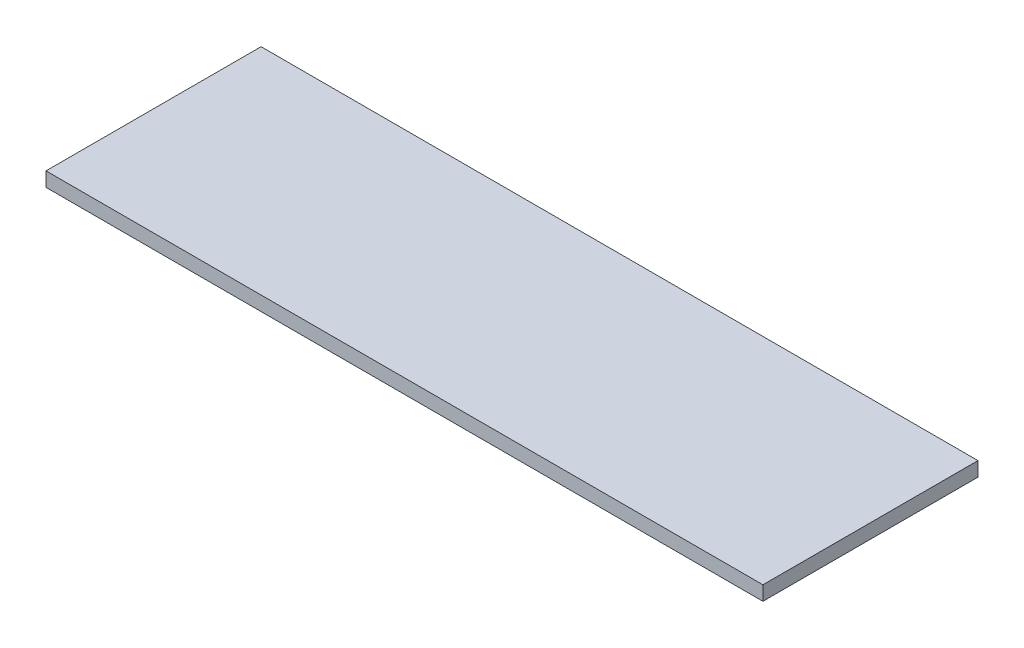
ISO-10303-21;
HEADER;
FILE_DESCRIPTION(('STEP AP214'),'2;1');
FILE_NAME('part.step','',(''),(''),'','','');
FILE_SCHEMA(('AUTOMOTIVE_DESIGN { 1 0 10303 214 1 1 1 1 }'));
ENDSEC;
DATA;
#1=APPLICATION_CONTEXT('core data for automotive mechanical design processes');
#2=APPLICATION_PROTOCOL_DEFINITION('international standard','automotive_design',2000,#1);
#3=PRODUCT_CONTEXT('',#1,'mechanical');
#4=PRODUCT('Part','Part','',(#3));
#5=PRODUCT_RELATED_PRODUCT_CATEGORY('part','',(#4));
#6=PRODUCT_DEFINITION_FORMATION('','',#4);
#7=PRODUCT_DEFINITION_CONTEXT('part definition',#1,'design');
#8=PRODUCT_DEFINITION('design','',#6,#7);
#9=PRODUCT_DEFINITION_SHAPE('','',#8);
#10=(LENGTH_UNIT() NAMED_UNIT(*) SI_UNIT(.MILLI.,.METRE.));
#11=(NAMED_UNIT(*) PLANE_ANGLE_UNIT() SI_UNIT($,.RADIAN.));
#12=(NAMED_UNIT(*) SI_UNIT($,.STERADIAN.) SOLID_ANGLE_UNIT());
#13=UNCERTAINTY_MEASURE_WITH_UNIT(LENGTH_MEASURE(1.E-05),#10,'distance_accuracy_value','');
#14=(GEOMETRIC_REPRESENTATION_CONTEXT(3) GLOBAL_UNCERTAINTY_ASSIGNED_CONTEXT((#13)) GLOBAL_UNIT_ASSIGNED_CONTEXT((#10,
#11,#12)) REPRESENTATION_CONTEXT('',''));
#15=CARTESIAN_POINT('',(0.,0.,0.));
#16=DIRECTION('',(0.,0.,1.));
#17=DIRECTION('',(1.,0.,0.));
#18=AXIS2_PLACEMENT_3D('',#15,#16,#17);
#19=CARTESIAN_POINT('',(5.,0.,0.));
#20=DIRECTION('',(0.,0.,1.));
#21=DIRECTION('',(1.,0.,0.));
#22=AXIS2_PLACEMENT_3D('',#19,#20,#21);
#23=PLANE('',#22);
#24=CARTESIAN_POINT('',(0.,5.,0.));
#25=DIRECTION('',(0.,0.,1.));
#26=DIRECTION('',(1.,0.,0.));
#27=AXIS2_PLACEMENT_3D('',#24,#25,#26);
#28=CIRCLE('',#27,1.5);
#29=CARTESIAN_POINT('',(-1.5,5.,0.));
#30=VERTEX_POINT('',#29);
#31=EDGE_CURVE('E166',#30,#30,#28,.T.);
#32=ORIENTED_EDGE('',*,*,#31,.T.);
#33=EDGE_LOOP('',(#32));
#34=FACE_BOUND('',#33,.T.);
#35=DIRECTION('',(0.,1.,0.));
#36=VECTOR('',#35,1.);
#37=CARTESIAN_POINT('',(-5.,0.,0.));
#38=LINE('',#37,#36);
#39=CARTESIAN_POINT('',(-5.,0.,0.));
#40=VERTEX_POINT('',#39);
#41=CARTESIAN_POINT('',(-5.,25.,0.));
#42=VERTEX_POINT('',#41);
#43=EDGE_CURVE('E71',#40,#42,#38,.T.);
#44=ORIENTED_EDGE('',*,*,#43,.T.);
#45=DIRECTION('',(-1.,0.,0.));
#46=VECTOR('',#45,1.);
#47=CARTESIAN_POINT('',(5.,25.,0.));
#48=LINE('',#47,#46);
#49=CARTESIAN_POINT('',(5.,25.,0.));
#50=VERTEX_POINT('',#49);
#51=EDGE_CURVE('E44',#50,#42,#48,.T.);
#52=ORIENTED_EDGE('',*,*,#51,.F.);
#53=DIRECTION('',(0.,1.,0.));
#54=VECTOR('',#53,1.);
#55=CARTESIAN_POINT('',(5.,0.,0.));
#56=LINE('',#55,#54);
#57=CARTESIAN_POINT('',(5.,0.,0.));
#58=VERTEX_POINT('',#57);
#59=EDGE_CURVE('E73',#58,#50,#56,.T.);
#60=ORIENTED_EDGE('',*,*,#59,.F.);
#61=DIRECTION('',(-1.,0.,0.));
#62=VECTOR('',#61,1.);
#63=CARTESIAN_POINT('',(5.,0.,0.));
#64=LINE('',#63,#62);
#65=EDGE_CURVE('E52',#58,#40,#64,.T.);
#66=ORIENTED_EDGE('',*,*,#65,.T.);
#67=EDGE_LOOP('',(#44,#52,#60,#66));
#68=FACE_BOUND('',#67,.T.);
#69=ADVANCED_FACE('F35',(#34,#68),#23,.F.);
#70=CARTESIAN_POINT('',(5.,0.,-2.));
#71=DIRECTION('',(0.,0.,-1.));
#72=DIRECTION('',(-1.,0.,0.));
#73=AXIS2_PLACEMENT_3D('',#70,#71,#72);
#74=PLANE('',#73);
#75=DIRECTION('',(-1.,0.,0.));
#76=VECTOR('',#75,1.);
#77=CARTESIAN_POINT('',(5.,25.,-2.));
#78=LINE('',#77,#76);
#79=CARTESIAN_POINT('',(50.,25.,-2.));
#80=VERTEX_POINT('',#79);
#81=CARTESIAN_POINT('',(-50.,25.,-2.));
#82=VERTEX_POINT('',#81);
#83=EDGE_CURVE('E105',#80,#82,#78,.T.);
#84=ORIENTED_EDGE('',*,*,#83,.T.);
#85=DIRECTION('',(0.,-1.,0.));
#86=VECTOR('',#85,1.);
#87=CARTESIAN_POINT('',(-50.,0.,-2.));
#88=LINE('',#87,#86);
#89=CARTESIAN_POINT('',(-50.,27.,-2.));
#90=VERTEX_POINT('',#89);
#91=EDGE_CURVE('E165',#90,#82,#88,.T.);
#92=ORIENTED_EDGE('',*,*,#91,.F.);
#93=DIRECTION('',(-1.,0.,0.));
#94=VECTOR('',#93,1.);
#95=CARTESIAN_POINT('',(5.,27.,-2.));
#96=LINE('',#95,#94);
#97=CARTESIAN_POINT('',(50.,27.,-2.));
#98=VERTEX_POINT('',#97);
#99=EDGE_CURVE('E102',#98,#90,#96,.T.);
#100=ORIENTED_EDGE('',*,*,#99,.F.);
#101=DIRECTION('',(0.,-1.,0.));
#102=VECTOR('',#101,1.);
#103=CARTESIAN_POINT('',(50.,0.,-2.));
#104=LINE('',#103,#102);
#105=EDGE_CURVE('E151',#98,#80,#104,.T.);
#106=ORIENTED_EDGE('',*,*,#105,.T.);
#107=EDGE_LOOP('',(#84,#92,#100,#106));
#108=FACE_BOUND('',#107,.T.);
#109=ADVANCED_FACE('F157',(#108),#74,.T.);
#110=CARTESIAN_POINT('',(5.,27.,0.));
#111=DIRECTION('',(0.,1.,0.));
#112=DIRECTION('',(0.,0.,1.));
#113=AXIS2_PLACEMENT_3D('',#110,#111,#112);
#114=PLANE('',#113);
#115=ORIENTED_EDGE('',*,*,#99,.T.);
#116=DIRECTION('',(0.,0.,-1.));
#117=VECTOR('',#116,1.);
#118=CARTESIAN_POINT('',(-50.,27.,0.));
#119=LINE('',#118,#117);
#120=CARTESIAN_POINT('',(-50.,27.,28.));
#121=VERTEX_POINT('',#120);
#122=EDGE_CURVE('E168',#121,#90,#119,.T.);
#123=ORIENTED_EDGE('',*,*,#122,.F.);
#124=DIRECTION('',(-1.,0.,0.));
#125=VECTOR('',#124,1.);
#126=CARTESIAN_POINT('',(5.,27.,28.));
#127=LINE('',#126,#125);
#128=CARTESIAN_POINT('',(50.,27.,28.));
#129=VERTEX_POINT('',#128);
#130=EDGE_CURVE('E99',#129,#121,#127,.T.);
#131=ORIENTED_EDGE('',*,*,#130,.F.);
#132=DIRECTION('',(0.,0.,-1.));
#133=VECTOR('',#132,1.);
#134=CARTESIAN_POINT('',(50.,27.,0.));
#135=LINE('',#134,#133);
#136=EDGE_CURVE('E158',#129,#98,#135,.T.);
#137=ORIENTED_EDGE('',*,*,#136,.T.);
#138=EDGE_LOOP('',(#115,#123,#131,#137));
#139=FACE_BOUND('',#138,.T.);
#140=ADVANCED_FACE('F197',(#139),#114,.T.);
#141=CARTESIAN_POINT('',(5.,0.,28.));
#142=DIRECTION('',(0.,0.,1.));
#143=DIRECTION('',(1.,0.,0.));
#144=AXIS2_PLACEMENT_3D('',#141,#142,#143);
#145=PLANE('',#144);
#146=ORIENTED_EDGE('',*,*,#130,.T.);
#147=DIRECTION('',(0.,1.,0.));
#148=VECTOR('',#147,1.);
#149=CARTESIAN_POINT('',(-50.,0.,28.));
#150=LINE('',#149,#148);
#151=CARTESIAN_POINT('',(-50.,25.,28.));
#152=VERTEX_POINT('',#151);
#153=EDGE_CURVE('E155',#152,#121,#150,.T.);
#154=ORIENTED_EDGE('',*,*,#153,.F.);
#155=DIRECTION('',(-1.,0.,0.));
#156=VECTOR('',#155,1.);
#157=CARTESIAN_POINT('',(5.,25.,28.));
#158=LINE('',#157,#156);
#159=CARTESIAN_POINT('',(50.,25.,28.));
#160=VERTEX_POINT('',#159);
#161=EDGE_CURVE('E96',#160,#152,#158,.T.);
#162=ORIENTED_EDGE('',*,*,#161,.F.);
#163=DIRECTION('',(0.,1.,0.));
#164=VECTOR('',#163,1.);
#165=CARTESIAN_POINT('',(50.,0.,28.));
#166=LINE('',#165,#164);
#167=EDGE_CURVE('E154',#160,#129,#166,.T.);
#168=ORIENTED_EDGE('',*,*,#167,.T.);
#169=EDGE_LOOP('',(#146,#154,#162,#168));
#170=FACE_BOUND('',#169,.T.);
#171=ADVANCED_FACE('F189',(#170),#145,.T.);
#172=CARTESIAN_POINT('',(5.,25.,0.));
#173=DIRECTION('',(0.,-1.,0.));
#174=DIRECTION('',(0.,0.,-1.));
#175=AXIS2_PLACEMENT_3D('',#172,#173,#174);
#176=PLANE('',#175);
#177=DIRECTION('',(0.,0.,1.));
#178=VECTOR('',#177,1.);
#179=CARTESIAN_POINT('',(50.,25.,0.));
#180=LINE('',#179,#178);
#181=EDGE_CURVE('E139',#80,#160,#180,.T.);
#182=ORIENTED_EDGE('',*,*,#181,.T.);
#183=ORIENTED_EDGE('',*,*,#161,.T.);
#184=DIRECTION('',(0.,0.,1.));
#185=VECTOR('',#184,1.);
#186=CARTESIAN_POINT('',(-50.,25.,0.));
#187=LINE('',#186,#185);
#188=EDGE_CURVE('E142',#82,#152,#187,.T.);
#189=ORIENTED_EDGE('',*,*,#188,.F.);
#190=ORIENTED_EDGE('',*,*,#83,.F.);
#191=EDGE_LOOP('',(#182,#183,#189,#190));
#192=FACE_BOUND('',#191,.T.);
#193=DIRECTION('',(-1.,0.,0.));
#194=VECTOR('',#193,1.);
#195=CARTESIAN_POINT('',(5.,25.,2.));
#196=LINE('',#195,#194);
#197=CARTESIAN_POINT('',(5.,25.,2.));
#198=VERTEX_POINT('',#197);
#199=CARTESIAN_POINT('',(-5.,25.,2.));
#200=VERTEX_POINT('',#199);
#201=EDGE_CURVE('E94',#198,#200,#196,.T.);
#202=ORIENTED_EDGE('',*,*,#201,.F.);
#203=DIRECTION('',(0.,0.,-1.));
#204=VECTOR('',#203,1.);
#205=CARTESIAN_POINT('',(5.,25.,0.));
#206=LINE('',#205,#204);
#207=EDGE_CURVE('E85',#198,#50,#206,.T.);
#208=ORIENTED_EDGE('',*,*,#207,.T.);
#209=ORIENTED_EDGE('',*,*,#51,.T.);
#210=DIRECTION('',(0.,0.,-1.));
#211=VECTOR('',#210,1.);
#212=CARTESIAN_POINT('',(-5.,25.,0.));
#213=LINE('',#212,#211);
#214=EDGE_CURVE('E11',#200,#42,#213,.T.);
#215=ORIENTED_EDGE('',*,*,#214,.F.);
#216=EDGE_LOOP('',(#202,#208,#209,#215));
#217=FACE_BOUND('',#216,.T.);
#218=ADVANCED_FACE('F111',(#192,#217),#176,.T.);
#219=CARTESIAN_POINT('',(5.,0.,2.));
#220=DIRECTION('',(0.,0.,1.));
#221=DIRECTION('',(1.,0.,0.));
#222=AXIS2_PLACEMENT_3D('',#219,#220,#221);
#223=PLANE('',#222);
#224=CARTESIAN_POINT('',(0.,5.,2.));
#225=DIRECTION('',(0.,0.,1.));
#226=DIRECTION('',(1.,0.,0.));
#227=AXIS2_PLACEMENT_3D('',#224,#225,#226);
#228=CIRCLE('',#227,1.5);
#229=CARTESIAN_POINT('',(-1.5,5.,2.));
#230=VERTEX_POINT('',#229);
#231=EDGE_CURVE('E38',#230,#230,#228,.T.);
#232=ORIENTED_EDGE('',*,*,#231,.F.);
#233=EDGE_LOOP('',(#232));
#234=FACE_BOUND('',#233,.T.);
#235=DIRECTION('',(0.,1.,0.));
#236=VECTOR('',#235,1.);
#237=CARTESIAN_POINT('',(-5.,0.,2.));
#238=LINE('',#237,#236);
#239=CARTESIAN_POINT('',(-5.,0.,2.));
#240=VERTEX_POINT('',#239);
#241=EDGE_CURVE('E84',#240,#200,#238,.T.);
#242=ORIENTED_EDGE('',*,*,#241,.F.);
#243=DIRECTION('',(-1.,0.,0.));
#244=VECTOR('',#243,1.);
#245=CARTESIAN_POINT('',(5.,0.,2.));
#246=LINE('',#245,#244);
#247=CARTESIAN_POINT('',(5.,0.,2.));
#248=VERTEX_POINT('',#247);
#249=EDGE_CURVE('E65',#248,#240,#246,.T.);
#250=ORIENTED_EDGE('',*,*,#249,.F.);
#251=DIRECTION('',(0.,1.,0.));
#252=VECTOR('',#251,1.);
#253=CARTESIAN_POINT('',(5.,0.,2.));
#254=LINE('',#253,#252);
#255=EDGE_CURVE('E89',#248,#198,#254,.T.);
#256=ORIENTED_EDGE('',*,*,#255,.T.);
#257=ORIENTED_EDGE('',*,*,#201,.T.);
#258=EDGE_LOOP('',(#242,#250,#256,#257));
#259=FACE_BOUND('',#258,.T.);
#260=ADVANCED_FACE('F180',(#234,#259),#223,.T.);
#261=CARTESIAN_POINT('',(5.,0.,0.));
#262=DIRECTION('',(0.,-1.,0.));
#263=DIRECTION('',(0.,0.,-1.));
#264=AXIS2_PLACEMENT_3D('',#261,#262,#263);
#265=PLANE('',#264);
#266=DIRECTION('',(0.,0.,1.));
#267=VECTOR('',#266,1.);
#268=CARTESIAN_POINT('',(-5.,0.,0.));
#269=LINE('',#268,#267);
#270=EDGE_CURVE('E81',#40,#240,#269,.T.);
#271=ORIENTED_EDGE('',*,*,#270,.F.);
#272=ORIENTED_EDGE('',*,*,#65,.F.);
#273=DIRECTION('',(0.,0.,1.));
#274=VECTOR('',#273,1.);
#275=CARTESIAN_POINT('',(5.,0.,0.));
#276=LINE('',#275,#274);
#277=EDGE_CURVE('E75',#58,#248,#276,.T.);
#278=ORIENTED_EDGE('',*,*,#277,.T.);
#279=ORIENTED_EDGE('',*,*,#249,.T.);
#280=EDGE_LOOP('',(#271,#272,#278,#279));
#281=FACE_BOUND('',#280,.T.);
#282=ADVANCED_FACE('F87',(#281),#265,.T.);
#283=CARTESIAN_POINT('',(5.,0.,0.));
#284=DIRECTION('',(1.,0.,0.));
#285=DIRECTION('',(0.,0.,-1.));
#286=AXIS2_PLACEMENT_3D('',#283,#284,#285);
#287=PLANE('',#286);
#288=ORIENTED_EDGE('',*,*,#207,.F.);
#289=ORIENTED_EDGE('',*,*,#255,.F.);
#290=ORIENTED_EDGE('',*,*,#277,.F.);
#291=ORIENTED_EDGE('',*,*,#59,.T.);
#292=EDGE_LOOP('',(#288,#289,#290,#291));
#293=FACE_BOUND('',#292,.T.);
#294=ADVANCED_FACE('F178',(#293),#287,.T.);
#295=CARTESIAN_POINT('',(-5.,0.,0.));
#296=DIRECTION('',(1.,0.,0.));
#297=DIRECTION('',(0.,0.,-1.));
#298=AXIS2_PLACEMENT_3D('',#295,#296,#297);
#299=PLANE('',#298);
#300=ORIENTED_EDGE('',*,*,#241,.T.);
#301=ORIENTED_EDGE('',*,*,#214,.T.);
#302=ORIENTED_EDGE('',*,*,#43,.F.);
#303=ORIENTED_EDGE('',*,*,#270,.T.);
#304=EDGE_LOOP('',(#300,#301,#302,#303));
#305=FACE_BOUND('',#304,.T.);
#306=ADVANCED_FACE('F80',(#305),#299,.F.);
#307=CARTESIAN_POINT('',(-50.,0.,0.));
#308=DIRECTION('',(1.,0.,0.));
#309=DIRECTION('',(0.,0.,-1.));
#310=AXIS2_PLACEMENT_3D('',#307,#308,#309);
#311=PLANE('',#310);
#312=ORIENTED_EDGE('',*,*,#188,.T.);
#313=ORIENTED_EDGE('',*,*,#153,.T.);
#314=ORIENTED_EDGE('',*,*,#122,.T.);
#315=ORIENTED_EDGE('',*,*,#91,.T.);
#316=EDGE_LOOP('',(#312,#313,#314,#315));
#317=FACE_BOUND('',#316,.T.);
#318=ADVANCED_FACE('F209',(#317),#311,.F.);
#319=CARTESIAN_POINT('',(50.,0.,0.));
#320=DIRECTION('',(1.,0.,0.));
#321=DIRECTION('',(0.,0.,-1.));
#322=AXIS2_PLACEMENT_3D('',#319,#320,#321);
#323=PLANE('',#322);
#324=ORIENTED_EDGE('',*,*,#181,.F.);
#325=ORIENTED_EDGE('',*,*,#105,.F.);
#326=ORIENTED_EDGE('',*,*,#136,.F.);
#327=ORIENTED_EDGE('',*,*,#167,.F.);
#328=EDGE_LOOP('',(#324,#325,#326,#327));
#329=FACE_BOUND('',#328,.T.);
#330=ADVANCED_FACE('F149',(#329),#323,.T.);
#331=CARTESIAN_POINT('',(0.,5.,28.));
#332=DIRECTION('',(0.,0.,-1.));
#333=DIRECTION('',(-1.,0.,0.));
#334=AXIS2_PLACEMENT_3D('',#331,#332,#333);
#335=CYLINDRICAL_SURFACE('',#334,1.5);
#336=CARTESIAN_POINT('',(-1.5,5.,2.));
#337=CARTESIAN_POINT('',(-1.5,5.,1.97916666666667));
#338=CARTESIAN_POINT('',(-1.5,5.,1.95833333333333));
#339=CARTESIAN_POINT('',(-1.5,5.,1.91666666666666));
#340=CARTESIAN_POINT('',(-1.5,5.,1.89583333333333));
#341=CARTESIAN_POINT('',(-1.5,5.,1.85416666666666));
#342=CARTESIAN_POINT('',(-1.5,5.,1.83333333333333));
#343=CARTESIAN_POINT('',(-1.5,5.,1.79166666666666));
#344=CARTESIAN_POINT('',(-1.5,5.,1.77083333333333));
#345=CARTESIAN_POINT('',(-1.5,5.,1.72916666666666));
#346=CARTESIAN_POINT('',(-1.5,5.,1.70833333333333));
#347=CARTESIAN_POINT('',(-1.5,5.,1.66666666666666));
#348=CARTESIAN_POINT('',(-1.5,5.,1.64583333333333));
#349=CARTESIAN_POINT('',(-1.5,5.,1.60416666666666));
#350=CARTESIAN_POINT('',(-1.5,5.,1.58333333333333));
#351=CARTESIAN_POINT('',(-1.5,5.,1.54166666666666));
#352=CARTESIAN_POINT('',(-1.5,5.,1.52083333333333));
#353=CARTESIAN_POINT('',(-1.5,5.,1.47916666666666));
#354=CARTESIAN_POINT('',(-1.5,5.,1.45833333333333));
#355=CARTESIAN_POINT('',(-1.5,5.,1.41666666666666));
#356=CARTESIAN_POINT('',(-1.5,5.,1.39583333333333));
#357=CARTESIAN_POINT('',(-1.5,5.,1.35416666666666));
#358=CARTESIAN_POINT('',(-1.5,5.,1.33333333333333));
#359=CARTESIAN_POINT('',(-1.5,5.,1.29166666666666));
#360=CARTESIAN_POINT('',(-1.5,5.,1.27083333333333));
#361=CARTESIAN_POINT('',(-1.5,5.,1.22916666666666));
#362=CARTESIAN_POINT('',(-1.5,5.,1.20833333333333));
#363=CARTESIAN_POINT('',(-1.5,5.,1.16666666666666));
#364=CARTESIAN_POINT('',(-1.5,5.,1.14583333333333));
#365=CARTESIAN_POINT('',(-1.5,5.,1.10416666666666));
#366=CARTESIAN_POINT('',(-1.5,5.,1.08333333333333));
#367=CARTESIAN_POINT('',(-1.5,5.,1.04166666666666));
#368=CARTESIAN_POINT('',(-1.5,5.,1.02083333333333));
#369=CARTESIAN_POINT('',(-1.5,5.,0.979166666666664));
#370=CARTESIAN_POINT('',(-1.5,5.,0.958333333333331));
#371=CARTESIAN_POINT('',(-1.5,5.,0.916666666666664));
#372=CARTESIAN_POINT('',(-1.5,5.,0.895833333333331));
#373=CARTESIAN_POINT('',(-1.5,5.,0.854166666666664));
#374=CARTESIAN_POINT('',(-1.5,5.,0.833333333333331));
#375=CARTESIAN_POINT('',(-1.5,5.,0.791666666666664));
#376=CARTESIAN_POINT('',(-1.5,5.,0.77083333333333));
#377=CARTESIAN_POINT('',(-1.5,5.,0.729166666666664));
#378=CARTESIAN_POINT('',(-1.5,5.,0.70833333333333));
#379=CARTESIAN_POINT('',(-1.5,5.,0.666666666666664));
#380=CARTESIAN_POINT('',(-1.5,5.,0.64583333333333));
#381=CARTESIAN_POINT('',(-1.5,5.,0.604166666666664));
#382=CARTESIAN_POINT('',(-1.5,5.,0.58333333333333));
#383=CARTESIAN_POINT('',(-1.5,5.,0.541666666666664));
#384=CARTESIAN_POINT('',(-1.5,5.,0.52083333333333));
#385=CARTESIAN_POINT('',(-1.5,5.,0.479166666666664));
#386=CARTESIAN_POINT('',(-1.5,5.,0.45833333333333));
#387=CARTESIAN_POINT('',(-1.5,5.,0.416666666666664));
#388=CARTESIAN_POINT('',(-1.5,5.,0.39583333333333));
#389=CARTESIAN_POINT('',(-1.5,5.,0.354166666666664));
#390=CARTESIAN_POINT('',(-1.5,5.,0.33333333333333));
#391=CARTESIAN_POINT('',(-1.5,5.,0.291666666666663));
#392=CARTESIAN_POINT('',(-1.5,5.,0.27083333333333));
#393=CARTESIAN_POINT('',(-1.5,5.,0.229166666666663));
#394=CARTESIAN_POINT('',(-1.5,5.,0.20833333333333));
#395=CARTESIAN_POINT('',(-1.5,5.,0.166666666666663));
#396=CARTESIAN_POINT('',(-1.5,5.,0.14583333333333));
#397=CARTESIAN_POINT('',(-1.5,5.,0.104166666666663));
#398=CARTESIAN_POINT('',(-1.5,5.,0.0833333333333299));
#399=CARTESIAN_POINT('',(-1.5,5.,0.0416666666666632));
#400=CARTESIAN_POINT('',(-1.5,5.,0.0208333333333299));
#401=CARTESIAN_POINT('',(-1.5,5.,0.));
#402=B_SPLINE_CURVE_WITH_KNOTS('',3,(#336,#337,#338,#339,#340,#341,#342,#343,#344,#345,#346,
#347,#348,#349,#350,#351,#352,#353,#354,#355,#356,#357,#358,#359,#360,#361,#362,#363,#364,#365,
#366,#367,#368,#369,#370,#371,#372,#373,#374,#375,#376,#377,#378,#379,#380,#381,#382,#383,#384,
#385,#386,#387,#388,#389,#390,#391,#392,#393,#394,#395,#396,#397,#398,#399,#400,#401),
.UNSPECIFIED.,.F.,.F.,(4,2,2,2,2,2,2,2,2,2,2,2,2,2,2,2,2,2,2,2,2,2,2,2,2,2,2,2,2,2,2,2,4),(0.,
0.0625000000000001,0.125,0.1875,0.25,0.3125,0.375,0.4375,0.5,0.5625,0.625000000000001,
0.687500000000001,0.750000000000001,0.812500000000001,0.875000000000001,0.937500000000001,1.,
1.0625,1.125,1.1875,1.25,1.3125,1.375,1.4375,1.5,1.5625,1.625,1.6875,1.75,1.8125,1.875,1.9375,
2.),.UNSPECIFIED.);
#403=EDGE_CURVE('BSEAM203',#230,#30,#402,.T.);
#404=ORIENTED_EDGE('',*,*,#231,.T.);
#405=ORIENTED_EDGE('',*,*,#31,.F.);
#406=ORIENTED_EDGE('',*,*,#403,.T.);
#407=ORIENTED_EDGE('',*,*,#403,.F.);
#408=EDGE_LOOP('',(#404,#406,#405,#407));
#409=FACE_BOUND('',#408,.T.);
#410=ADVANCED_FACE('F203',(#409),#335,.F.);
#411=CLOSED_SHELL('',(#69,#109,#140,#171,#218,#260,#282,#294,#306,#318,#330,#410));
#412=MANIFOLD_SOLID_BREP('B2',#411);
#413=ADVANCED_BREP_SHAPE_REPRESENTATION('',(#18,#412),#14);
#414=SHAPE_DEFINITION_REPRESENTATION(#9,#413);
ENDSEC;
END-ISO-10303-21;
